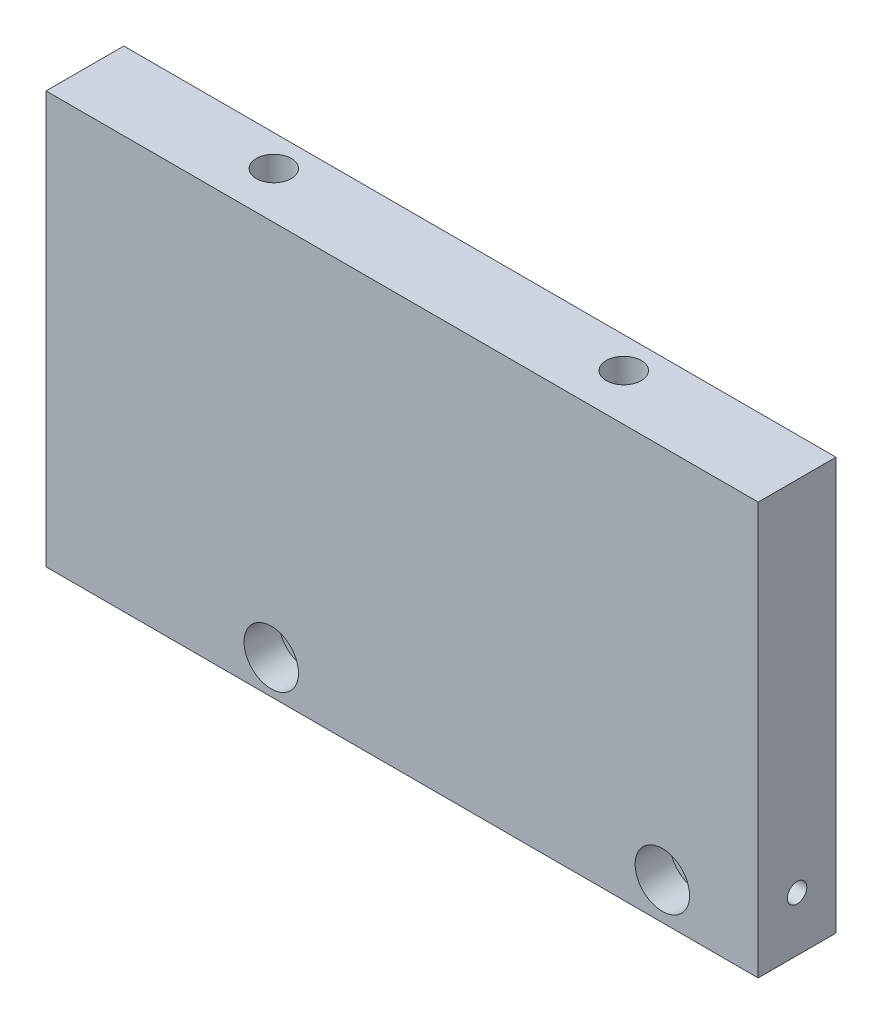
ISO-10303-21;
HEADER;
FILE_DESCRIPTION(('STEP AP214'),'2;1');
FILE_NAME('part.step','',(''),(''),'','','');
FILE_SCHEMA(('AUTOMOTIVE_DESIGN { 1 0 10303 214 1 1 1 1 }'));
ENDSEC;
DATA;
#1=APPLICATION_CONTEXT('core data for automotive mechanical design processes');
#2=APPLICATION_PROTOCOL_DEFINITION('international standard','automotive_design',2000,#1);
#3=PRODUCT_CONTEXT('',#1,'mechanical');
#4=PRODUCT('Part','Part','',(#3));
#5=PRODUCT_RELATED_PRODUCT_CATEGORY('part','',(#4));
#6=PRODUCT_DEFINITION_FORMATION('','',#4);
#7=PRODUCT_DEFINITION_CONTEXT('part definition',#1,'design');
#8=PRODUCT_DEFINITION('design','',#6,#7);
#9=PRODUCT_DEFINITION_SHAPE('','',#8);
#10=(LENGTH_UNIT() NAMED_UNIT(*) SI_UNIT(.MILLI.,.METRE.));
#11=(NAMED_UNIT(*) PLANE_ANGLE_UNIT() SI_UNIT($,.RADIAN.));
#12=(NAMED_UNIT(*) SI_UNIT($,.STERADIAN.) SOLID_ANGLE_UNIT());
#13=UNCERTAINTY_MEASURE_WITH_UNIT(LENGTH_MEASURE(1.E-05),#10,'distance_accuracy_value','');
#14=(GEOMETRIC_REPRESENTATION_CONTEXT(3) GLOBAL_UNCERTAINTY_ASSIGNED_CONTEXT((#13)) GLOBAL_UNIT_ASSIGNED_CONTEXT((#10,
#11,#12)) REPRESENTATION_CONTEXT('',''));
#15=CARTESIAN_POINT('',(0.,0.,0.));
#16=DIRECTION('',(0.,0.,1.));
#17=DIRECTION('',(1.,0.,0.));
#18=AXIS2_PLACEMENT_3D('',#15,#16,#17);
#19=CARTESIAN_POINT('',(-16.828,4.382,-5.));
#20=DIRECTION('',(0.,0.,1.));
#21=DIRECTION('',(1.,0.,0.));
#22=AXIS2_PLACEMENT_3D('',#19,#20,#21);
#23=CYLINDRICAL_SURFACE('',#22,1.75);
#24=CARTESIAN_POINT('',(-16.828,4.382,-5.));
#25=DIRECTION('',(0.,0.,1.));
#26=DIRECTION('',(1.,0.,0.));
#27=AXIS2_PLACEMENT_3D('',#24,#25,#26);
#28=CIRCLE('',#27,1.75);
#29=CARTESIAN_POINT('',(-15.078,4.382,-5.));
#30=VERTEX_POINT('',#29);
#31=EDGE_CURVE('E244',#30,#30,#28,.T.);
#32=ORIENTED_EDGE('',*,*,#31,.F.);
#33=EDGE_LOOP('',(#32));
#34=FACE_BOUND('',#33,.T.);
#35=CARTESIAN_POINT('',(-16.828,4.382,0.5));
#36=DIRECTION('',(0.,0.,1.));
#37=DIRECTION('',(1.,0.,0.));
#38=AXIS2_PLACEMENT_3D('',#35,#36,#37);
#39=CIRCLE('',#38,1.75);
#40=CARTESIAN_POINT('',(-15.078,4.382,0.5));
#41=VERTEX_POINT('',#40);
#42=EDGE_CURVE('E230',#41,#41,#39,.F.);
#43=ORIENTED_EDGE('',*,*,#42,.F.);
#44=EDGE_LOOP('',(#43));
#45=FACE_BOUND('',#44,.T.);
#46=ADVANCED_FACE('F49',(#34,#45),#23,.F.);
#47=CARTESIAN_POINT('',(33.464,4.763,-5.));
#48=DIRECTION('',(0.,0.,1.));
#49=DIRECTION('',(1.,0.,0.));
#50=AXIS2_PLACEMENT_3D('',#47,#48,#49);
#51=CYLINDRICAL_SURFACE('',#50,1.75);
#52=CARTESIAN_POINT('',(33.464,4.763,-5.));
#53=DIRECTION('',(0.,0.,1.));
#54=DIRECTION('',(1.,0.,0.));
#55=AXIS2_PLACEMENT_3D('',#52,#53,#54);
#56=CIRCLE('',#55,1.75);
#57=CARTESIAN_POINT('',(35.214,4.763,-5.));
#58=VERTEX_POINT('',#57);
#59=EDGE_CURVE('E280',#58,#58,#56,.T.);
#60=ORIENTED_EDGE('',*,*,#59,.F.);
#61=EDGE_LOOP('',(#60));
#62=FACE_BOUND('',#61,.T.);
#63=CARTESIAN_POINT('',(33.464,4.763,0.5));
#64=DIRECTION('',(0.,0.,1.));
#65=DIRECTION('',(1.,0.,0.));
#66=AXIS2_PLACEMENT_3D('',#63,#64,#65);
#67=CIRCLE('',#66,1.75);
#68=CARTESIAN_POINT('',(35.214,4.763,0.5));
#69=VERTEX_POINT('',#68);
#70=EDGE_CURVE('E214',#69,#69,#67,.F.);
#71=ORIENTED_EDGE('',*,*,#70,.F.);
#72=EDGE_LOOP('',(#71));
#73=FACE_BOUND('',#72,.T.);
#74=ADVANCED_FACE('F432',(#62,#73),#51,.F.);
#75=CARTESIAN_POINT('',(45.79,53.,-5.));
#76=DIRECTION('',(-1.,0.,0.));
#77=DIRECTION('',(0.,0.,1.));
#78=AXIS2_PLACEMENT_3D('',#75,#76,#77);
#79=PLANE('',#78);
#80=CARTESIAN_POINT('',(45.79,7.,0.));
#81=DIRECTION('',(1.,0.,0.));
#82=DIRECTION('',(0.,0.,-1.));
#83=AXIS2_PLACEMENT_3D('',#80,#81,#82);
#84=CIRCLE('',#83,1.24999999999999);
#85=CARTESIAN_POINT('',(45.79,7.,-1.24999999999999));
#86=VERTEX_POINT('',#85);
#87=EDGE_CURVE('E200',#86,#86,#84,.T.);
#88=ORIENTED_EDGE('',*,*,#87,.F.);
#89=EDGE_LOOP('',(#88));
#90=FACE_BOUND('',#89,.T.);
#91=DIRECTION('',(0.,0.,-1.));
#92=VECTOR('',#91,1.);
#93=CARTESIAN_POINT('',(45.79,0.,-5.));
#94=LINE('',#93,#92);
#95=CARTESIAN_POINT('',(45.79,0.,5.));
#96=VERTEX_POINT('',#95);
#97=CARTESIAN_POINT('',(45.79,0.,-5.));
#98=VERTEX_POINT('',#97);
#99=EDGE_CURVE('E283',#96,#98,#94,.T.);
#100=ORIENTED_EDGE('',*,*,#99,.T.);
#101=DIRECTION('',(0.,-1.,0.));
#102=VECTOR('',#101,1.);
#103=CARTESIAN_POINT('',(45.79,53.,-5.));
#104=LINE('',#103,#102);
#105=CARTESIAN_POINT('',(45.79,53.,-5.));
#106=VERTEX_POINT('',#105);
#107=EDGE_CURVE('E312',#106,#98,#104,.T.);
#108=ORIENTED_EDGE('',*,*,#107,.F.);
#109=DIRECTION('',(0.,0.,-1.));
#110=VECTOR('',#109,1.);
#111=CARTESIAN_POINT('',(45.79,53.,-5.));
#112=LINE('',#111,#110);
#113=CARTESIAN_POINT('',(45.79,53.,5.));
#114=VERTEX_POINT('',#113);
#115=EDGE_CURVE('E286',#114,#106,#112,.T.);
#116=ORIENTED_EDGE('',*,*,#115,.F.);
#117=DIRECTION('',(0.,-1.,0.));
#118=VECTOR('',#117,1.);
#119=CARTESIAN_POINT('',(45.79,53.,5.));
#120=LINE('',#119,#118);
#121=EDGE_CURVE('E296',#114,#96,#120,.T.);
#122=ORIENTED_EDGE('',*,*,#121,.T.);
#123=EDGE_LOOP('',(#100,#108,#116,#122));
#124=FACE_BOUND('',#123,.T.);
#125=ADVANCED_FACE('F439',(#90,#124),#79,.F.);
#126=CARTESIAN_POINT('',(-45.79,53.,-5.));
#127=DIRECTION('',(0.,0.,1.));
#128=DIRECTION('',(1.,0.,0.));
#129=AXIS2_PLACEMENT_3D('',#126,#127,#128);
#130=PLANE('',#129);
#131=DIRECTION('',(1.,0.,0.));
#132=VECTOR('',#131,1.);
#133=CARTESIAN_POINT('',(-30.,48.,-5.));
#134=LINE('',#133,#132);
#135=CARTESIAN_POINT('',(-27.5,48.,-5.));
#136=VERTEX_POINT('',#135);
#137=CARTESIAN_POINT('',(-17.5,48.,-5.));
#138=VERTEX_POINT('',#137);
#139=EDGE_CURVE('E248',#136,#138,#134,.T.);
#140=ORIENTED_EDGE('',*,*,#139,.F.);
#141=CARTESIAN_POINT('',(-27.5,45.5,-5.));
#142=DIRECTION('',(0.,0.,1.));
#143=DIRECTION('',(1.,0.,0.));
#144=AXIS2_PLACEMENT_3D('',#141,#142,#143);
#145=CIRCLE('',#144,2.5);
#146=CARTESIAN_POINT('',(-30.,45.5,-5.));
#147=VERTEX_POINT('',#146);
#148=EDGE_CURVE('E378',#136,#147,#145,.T.);
#149=ORIENTED_EDGE('',*,*,#148,.T.);
#150=DIRECTION('',(0.,1.,0.));
#151=VECTOR('',#150,1.);
#152=CARTESIAN_POINT('',(-30.,23.,-5.));
#153=LINE('',#152,#151);
#154=CARTESIAN_POINT('',(-30.,25.5,-5.));
#155=VERTEX_POINT('',#154);
#156=EDGE_CURVE('E245',#155,#147,#153,.T.);
#157=ORIENTED_EDGE('',*,*,#156,.F.);
#158=CARTESIAN_POINT('',(-27.5,25.5,-5.));
#159=DIRECTION('',(0.,0.,1.));
#160=DIRECTION('',(1.,0.,0.));
#161=AXIS2_PLACEMENT_3D('',#158,#159,#160);
#162=CIRCLE('',#161,2.5);
#163=CARTESIAN_POINT('',(-27.5,23.,-5.));
#164=VERTEX_POINT('',#163);
#165=EDGE_CURVE('E382',#155,#164,#162,.T.);
#166=ORIENTED_EDGE('',*,*,#165,.T.);
#167=DIRECTION('',(-1.,0.,0.));
#168=VECTOR('',#167,1.);
#169=CARTESIAN_POINT('',(-30.,23.,-5.));
#170=LINE('',#169,#168);
#171=CARTESIAN_POINT('',(-17.5,23.,-5.));
#172=VERTEX_POINT('',#171);
#173=EDGE_CURVE('E235',#172,#164,#170,.T.);
#174=ORIENTED_EDGE('',*,*,#173,.F.);
#175=CARTESIAN_POINT('',(-17.5,25.5,-5.));
#176=DIRECTION('',(0.,0.,1.));
#177=DIRECTION('',(1.,0.,0.));
#178=AXIS2_PLACEMENT_3D('',#175,#176,#177);
#179=CIRCLE('',#178,2.5);
#180=CARTESIAN_POINT('',(-15.,25.5,-5.));
#181=VERTEX_POINT('',#180);
#182=EDGE_CURVE('E380',#172,#181,#179,.T.);
#183=ORIENTED_EDGE('',*,*,#182,.T.);
#184=DIRECTION('',(0.,-1.,0.));
#185=VECTOR('',#184,1.);
#186=CARTESIAN_POINT('',(-15.,23.,-5.));
#187=LINE('',#186,#185);
#188=CARTESIAN_POINT('',(-15.,45.5,-5.));
#189=VERTEX_POINT('',#188);
#190=EDGE_CURVE('E252',#189,#181,#187,.T.);
#191=ORIENTED_EDGE('',*,*,#190,.F.);
#192=CARTESIAN_POINT('',(-17.5,45.5,-5.));
#193=DIRECTION('',(0.,0.,1.));
#194=DIRECTION('',(1.,0.,0.));
#195=AXIS2_PLACEMENT_3D('',#192,#193,#194);
#196=CIRCLE('',#195,2.5);
#197=EDGE_CURVE('E384',#189,#138,#196,.T.);
#198=ORIENTED_EDGE('',*,*,#197,.T.);
#199=EDGE_LOOP('',(#140,#149,#157,#166,#174,#183,#191,#198));
#200=FACE_BOUND('',#199,.T.);
#201=DIRECTION('',(1.,0.,0.));
#202=VECTOR('',#201,1.);
#203=CARTESIAN_POINT('',(15.,48.,-5.));
#204=LINE('',#203,#202);
#205=CARTESIAN_POINT('',(17.5,48.,-5.));
#206=VERTEX_POINT('',#205);
#207=CARTESIAN_POINT('',(27.5,48.,-5.));
#208=VERTEX_POINT('',#207);
#209=EDGE_CURVE('E264',#206,#208,#204,.T.);
#210=ORIENTED_EDGE('',*,*,#209,.F.);
#211=CARTESIAN_POINT('',(17.5,45.5,-5.));
#212=DIRECTION('',(0.,0.,1.));
#213=DIRECTION('',(1.,0.,0.));
#214=AXIS2_PLACEMENT_3D('',#211,#212,#213);
#215=CIRCLE('',#214,2.5);
#216=CARTESIAN_POINT('',(15.,45.5,-5.));
#217=VERTEX_POINT('',#216);
#218=EDGE_CURVE('E11',#206,#217,#215,.T.);
#219=ORIENTED_EDGE('',*,*,#218,.T.);
#220=DIRECTION('',(0.,1.,0.));
#221=VECTOR('',#220,1.);
#222=CARTESIAN_POINT('',(15.,48.,-5.));
#223=LINE('',#222,#221);
#224=CARTESIAN_POINT('',(15.,25.5,-5.));
#225=VERTEX_POINT('',#224);
#226=EDGE_CURVE('E249',#225,#217,#223,.T.);
#227=ORIENTED_EDGE('',*,*,#226,.F.);
#228=CARTESIAN_POINT('',(17.5,25.5,-5.));
#229=DIRECTION('',(0.,0.,1.));
#230=DIRECTION('',(1.,0.,0.));
#231=AXIS2_PLACEMENT_3D('',#228,#229,#230);
#232=CIRCLE('',#231,2.5);
#233=CARTESIAN_POINT('',(17.5,23.,-5.));
#234=VERTEX_POINT('',#233);
#235=EDGE_CURVE('E57',#225,#234,#232,.T.);
#236=ORIENTED_EDGE('',*,*,#235,.T.);
#237=DIRECTION('',(-1.,0.,0.));
#238=VECTOR('',#237,1.);
#239=CARTESIAN_POINT('',(15.,23.,-5.));
#240=LINE('',#239,#238);
#241=CARTESIAN_POINT('',(27.5,23.,-5.));
#242=VERTEX_POINT('',#241);
#243=EDGE_CURVE('E257',#242,#234,#240,.T.);
#244=ORIENTED_EDGE('',*,*,#243,.F.);
#245=CARTESIAN_POINT('',(27.5,25.5,-5.));
#246=DIRECTION('',(0.,0.,1.));
#247=DIRECTION('',(1.,0.,0.));
#248=AXIS2_PLACEMENT_3D('',#245,#246,#247);
#249=CIRCLE('',#248,2.5);
#250=CARTESIAN_POINT('',(30.,25.5,-5.));
#251=VERTEX_POINT('',#250);
#252=EDGE_CURVE('E388',#242,#251,#249,.T.);
#253=ORIENTED_EDGE('',*,*,#252,.T.);
#254=DIRECTION('',(0.,-1.,0.));
#255=VECTOR('',#254,1.);
#256=CARTESIAN_POINT('',(30.,48.,-5.));
#257=LINE('',#256,#255);
#258=CARTESIAN_POINT('',(30.,45.5,-5.));
#259=VERTEX_POINT('',#258);
#260=EDGE_CURVE('E260',#259,#251,#257,.T.);
#261=ORIENTED_EDGE('',*,*,#260,.F.);
#262=CARTESIAN_POINT('',(27.5,45.5,-5.));
#263=DIRECTION('',(0.,0.,1.));
#264=DIRECTION('',(1.,0.,0.));
#265=AXIS2_PLACEMENT_3D('',#262,#263,#264);
#266=CIRCLE('',#265,2.5);
#267=EDGE_CURVE('E386',#259,#208,#266,.T.);
#268=ORIENTED_EDGE('',*,*,#267,.T.);
#269=EDGE_LOOP('',(#210,#219,#227,#236,#244,#253,#261,#268));
#270=FACE_BOUND('',#269,.T.);
#271=ORIENTED_EDGE('',*,*,#59,.T.);
#272=EDGE_LOOP('',(#271));
#273=FACE_BOUND('',#272,.T.);
#274=ORIENTED_EDGE('',*,*,#31,.T.);
#275=EDGE_LOOP('',(#274));
#276=FACE_BOUND('',#275,.T.);
#277=DIRECTION('',(-1.,0.,0.));
#278=VECTOR('',#277,1.);
#279=CARTESIAN_POINT('',(-45.79,0.,-5.));
#280=LINE('',#279,#278);
#281=CARTESIAN_POINT('',(-45.79,0.,-5.));
#282=VERTEX_POINT('',#281);
#283=EDGE_CURVE('E299',#98,#282,#280,.T.);
#284=ORIENTED_EDGE('',*,*,#283,.T.);
#285=DIRECTION('',(0.,-1.,0.));
#286=VECTOR('',#285,1.);
#287=CARTESIAN_POINT('',(-45.79,53.,-5.));
#288=LINE('',#287,#286);
#289=CARTESIAN_POINT('',(-45.79,53.,-5.));
#290=VERTEX_POINT('',#289);
#291=EDGE_CURVE('E309',#290,#282,#288,.T.);
#292=ORIENTED_EDGE('',*,*,#291,.F.);
#293=DIRECTION('',(-1.,0.,0.));
#294=VECTOR('',#293,1.);
#295=CARTESIAN_POINT('',(-45.79,53.,-5.));
#296=LINE('',#295,#294);
#297=EDGE_CURVE('E289',#106,#290,#296,.T.);
#298=ORIENTED_EDGE('',*,*,#297,.F.);
#299=ORIENTED_EDGE('',*,*,#107,.T.);
#300=EDGE_LOOP('',(#284,#292,#298,#299));
#301=FACE_BOUND('',#300,.T.);
#302=ADVANCED_FACE('F390',(#200,#270,#273,#276,#301),#130,.F.);
#303=CARTESIAN_POINT('',(-45.79,53.,-5.));
#304=DIRECTION('',(1.,0.,0.));
#305=DIRECTION('',(0.,0.,-1.));
#306=AXIS2_PLACEMENT_3D('',#303,#304,#305);
#307=PLANE('',#306);
#308=CARTESIAN_POINT('',(-45.79,7.,0.));
#309=DIRECTION('',(-1.,0.,0.));
#310=DIRECTION('',(0.,0.,1.));
#311=AXIS2_PLACEMENT_3D('',#308,#309,#310);
#312=CIRCLE('',#311,1.24999999999999);
#313=CARTESIAN_POINT('',(-45.79,7.,1.24999999999999));
#314=VERTEX_POINT('',#313);
#315=EDGE_CURVE('E199',#314,#314,#312,.T.);
#316=ORIENTED_EDGE('',*,*,#315,.F.);
#317=EDGE_LOOP('',(#316));
#318=FACE_BOUND('',#317,.T.);
#319=DIRECTION('',(0.,0.,1.));
#320=VECTOR('',#319,1.);
#321=CARTESIAN_POINT('',(-45.79,0.,-5.));
#322=LINE('',#321,#320);
#323=CARTESIAN_POINT('',(-45.79,0.,5.));
#324=VERTEX_POINT('',#323);
#325=EDGE_CURVE('E301',#282,#324,#322,.T.);
#326=ORIENTED_EDGE('',*,*,#325,.T.);
#327=DIRECTION('',(0.,-1.,0.));
#328=VECTOR('',#327,1.);
#329=CARTESIAN_POINT('',(-45.79,53.,5.));
#330=LINE('',#329,#328);
#331=CARTESIAN_POINT('',(-45.79,53.,5.));
#332=VERTEX_POINT('',#331);
#333=EDGE_CURVE('E306',#332,#324,#330,.T.);
#334=ORIENTED_EDGE('',*,*,#333,.F.);
#335=DIRECTION('',(0.,0.,1.));
#336=VECTOR('',#335,1.);
#337=CARTESIAN_POINT('',(-45.79,53.,-5.));
#338=LINE('',#337,#336);
#339=EDGE_CURVE('E292',#290,#332,#338,.T.);
#340=ORIENTED_EDGE('',*,*,#339,.F.);
#341=ORIENTED_EDGE('',*,*,#291,.T.);
#342=EDGE_LOOP('',(#326,#334,#340,#341));
#343=FACE_BOUND('',#342,.T.);
#344=ADVANCED_FACE('F457',(#318,#343),#307,.F.);
#345=CARTESIAN_POINT('',(-45.79,53.,5.));
#346=DIRECTION('',(0.,0.,-1.));
#347=DIRECTION('',(-1.,0.,0.));
#348=AXIS2_PLACEMENT_3D('',#345,#346,#347);
#349=PLANE('',#348);
#350=CARTESIAN_POINT('',(33.464,4.763,5.));
#351=DIRECTION('',(0.,0.,1.));
#352=DIRECTION('',(1.,0.,0.));
#353=AXIS2_PLACEMENT_3D('',#350,#351,#352);
#354=CIRCLE('',#353,3.5);
#355=CARTESIAN_POINT('',(36.964,4.763,5.));
#356=VERTEX_POINT('',#355);
#357=EDGE_CURVE('E215',#356,#356,#354,.T.);
#358=ORIENTED_EDGE('',*,*,#357,.F.);
#359=EDGE_LOOP('',(#358));
#360=FACE_BOUND('',#359,.T.);
#361=CARTESIAN_POINT('',(-16.828,4.382,5.));
#362=DIRECTION('',(0.,0.,1.));
#363=DIRECTION('',(1.,0.,0.));
#364=AXIS2_PLACEMENT_3D('',#361,#362,#363);
#365=CIRCLE('',#364,3.5);
#366=CARTESIAN_POINT('',(-13.328,4.382,5.));
#367=VERTEX_POINT('',#366);
#368=EDGE_CURVE('E218',#367,#367,#365,.T.);
#369=ORIENTED_EDGE('',*,*,#368,.F.);
#370=EDGE_LOOP('',(#369));
#371=FACE_BOUND('',#370,.T.);
#372=DIRECTION('',(1.,0.,0.));
#373=VECTOR('',#372,1.);
#374=CARTESIAN_POINT('',(-45.79,0.,5.));
#375=LINE('',#374,#373);
#376=EDGE_CURVE('E290',#324,#96,#375,.T.);
#377=ORIENTED_EDGE('',*,*,#376,.T.);
#378=ORIENTED_EDGE('',*,*,#121,.F.);
#379=DIRECTION('',(1.,0.,0.));
#380=VECTOR('',#379,1.);
#381=CARTESIAN_POINT('',(-45.79,53.,5.));
#382=LINE('',#381,#380);
#383=EDGE_CURVE('E294',#332,#114,#382,.T.);
#384=ORIENTED_EDGE('',*,*,#383,.F.);
#385=ORIENTED_EDGE('',*,*,#333,.T.);
#386=EDGE_LOOP('',(#377,#378,#384,#385));
#387=FACE_BOUND('',#386,.T.);
#388=ADVANCED_FACE('F450',(#360,#371,#387),#349,.F.);
#389=CARTESIAN_POINT('',(0.,53.,0.));
#390=DIRECTION('',(0.,1.,0.));
#391=DIRECTION('',(0.,0.,1.));
#392=AXIS2_PLACEMENT_3D('',#389,#390,#391);
#393=PLANE('',#392);
#394=CARTESIAN_POINT('',(22.5,53.,-1.));
#395=DIRECTION('',(0.,1.,0.));
#396=DIRECTION('',(0.,0.,1.));
#397=AXIS2_PLACEMENT_3D('',#394,#395,#396);
#398=CIRCLE('',#397,2.25);
#399=CARTESIAN_POINT('',(22.5,53.,1.25));
#400=VERTEX_POINT('',#399);
#401=EDGE_CURVE('E223',#400,#400,#398,.T.);
#402=ORIENTED_EDGE('',*,*,#401,.F.);
#403=EDGE_LOOP('',(#402));
#404=FACE_BOUND('',#403,.T.);
#405=CARTESIAN_POINT('',(-22.5,53.,-1.));
#406=DIRECTION('',(0.,1.,0.));
#407=DIRECTION('',(0.,0.,1.));
#408=AXIS2_PLACEMENT_3D('',#405,#406,#407);
#409=CIRCLE('',#408,2.25);
#410=CARTESIAN_POINT('',(-22.5,53.,1.25));
#411=VERTEX_POINT('',#410);
#412=EDGE_CURVE('E227',#411,#411,#409,.T.);
#413=ORIENTED_EDGE('',*,*,#412,.F.);
#414=EDGE_LOOP('',(#413));
#415=FACE_BOUND('',#414,.T.);
#416=ORIENTED_EDGE('',*,*,#115,.T.);
#417=ORIENTED_EDGE('',*,*,#297,.T.);
#418=ORIENTED_EDGE('',*,*,#339,.T.);
#419=ORIENTED_EDGE('',*,*,#383,.T.);
#420=EDGE_LOOP('',(#416,#417,#418,#419));
#421=FACE_BOUND('',#420,.T.);
#422=ADVANCED_FACE('F446',(#404,#415,#421),#393,.T.);
#423=CARTESIAN_POINT('',(0.,0.,0.));
#424=DIRECTION('',(0.,1.,0.));
#425=DIRECTION('',(0.,0.,1.));
#426=AXIS2_PLACEMENT_3D('',#423,#424,#425);
#427=PLANE('',#426);
#428=ORIENTED_EDGE('',*,*,#99,.F.);
#429=ORIENTED_EDGE('',*,*,#376,.F.);
#430=ORIENTED_EDGE('',*,*,#325,.F.);
#431=ORIENTED_EDGE('',*,*,#283,.F.);
#432=EDGE_LOOP('',(#428,#429,#430,#431));
#433=FACE_BOUND('',#432,.T.);
#434=ADVANCED_FACE('F449',(#433),#427,.F.);
#435=CARTESIAN_POINT('',(15.,48.,3.));
#436=DIRECTION('',(-1.,0.,0.));
#437=DIRECTION('',(0.,-1.,0.));
#438=AXIS2_PLACEMENT_3D('',#435,#436,#437);
#439=PLANE('',#438);
#440=DIRECTION('',(0.,1.,0.));
#441=VECTOR('',#440,1.);
#442=CARTESIAN_POINT('',(15.,48.,3.));
#443=LINE('',#442,#441);
#444=CARTESIAN_POINT('',(15.,25.5,3.));
#445=VERTEX_POINT('',#444);
#446=CARTESIAN_POINT('',(15.,45.5,3.));
#447=VERTEX_POINT('',#446);
#448=EDGE_CURVE('E261',#445,#447,#443,.T.);
#449=ORIENTED_EDGE('',*,*,#448,.F.);
#450=DIRECTION('',(0.,0.,-1.));
#451=VECTOR('',#450,1.);
#452=CARTESIAN_POINT('',(15.,25.5,-5.));
#453=LINE('',#452,#451);
#454=EDGE_CURVE('E376',#445,#225,#453,.T.);
#455=ORIENTED_EDGE('',*,*,#454,.T.);
#456=ORIENTED_EDGE('',*,*,#226,.T.);
#457=DIRECTION('',(0.,0.,-1.));
#458=VECTOR('',#457,1.);
#459=CARTESIAN_POINT('',(15.,45.5,3.));
#460=LINE('',#459,#458);
#461=EDGE_CURVE('E374',#217,#447,#460,.F.);
#462=ORIENTED_EDGE('',*,*,#461,.T.);
#463=EDGE_LOOP('',(#449,#455,#456,#462));
#464=FACE_BOUND('',#463,.T.);
#465=ADVANCED_FACE('F403',(#464),#439,.F.);
#466=CARTESIAN_POINT('',(15.,23.,3.));
#467=DIRECTION('',(0.,-1.,0.));
#468=DIRECTION('',(0.,0.,-1.));
#469=AXIS2_PLACEMENT_3D('',#466,#467,#468);
#470=PLANE('',#469);
#471=DIRECTION('',(-1.,0.,0.));
#472=VECTOR('',#471,1.);
#473=CARTESIAN_POINT('',(15.,23.,3.));
#474=LINE('',#473,#472);
#475=CARTESIAN_POINT('',(27.5,23.,3.));
#476=VERTEX_POINT('',#475);
#477=CARTESIAN_POINT('',(17.5,23.,3.));
#478=VERTEX_POINT('',#477);
#479=EDGE_CURVE('E268',#476,#478,#474,.T.);
#480=ORIENTED_EDGE('',*,*,#479,.F.);
#481=DIRECTION('',(0.,0.,-1.));
#482=VECTOR('',#481,1.);
#483=CARTESIAN_POINT('',(27.5,23.,-5.));
#484=LINE('',#483,#482);
#485=EDGE_CURVE('E371',#476,#242,#484,.T.);
#486=ORIENTED_EDGE('',*,*,#485,.T.);
#487=ORIENTED_EDGE('',*,*,#243,.T.);
#488=DIRECTION('',(0.,0.,-1.));
#489=VECTOR('',#488,1.);
#490=CARTESIAN_POINT('',(17.5,23.,3.));
#491=LINE('',#490,#489);
#492=EDGE_CURVE('E369',#234,#478,#491,.F.);
#493=ORIENTED_EDGE('',*,*,#492,.T.);
#494=EDGE_LOOP('',(#480,#486,#487,#493));
#495=FACE_BOUND('',#494,.T.);
#496=ADVANCED_FACE('F394',(#495),#470,.F.);
#497=CARTESIAN_POINT('',(30.,48.,3.));
#498=DIRECTION('',(1.,0.,0.));
#499=DIRECTION('',(0.,1.,0.));
#500=AXIS2_PLACEMENT_3D('',#497,#498,#499);
#501=PLANE('',#500);
#502=DIRECTION('',(0.,-1.,0.));
#503=VECTOR('',#502,1.);
#504=CARTESIAN_POINT('',(30.,48.,3.));
#505=LINE('',#504,#503);
#506=CARTESIAN_POINT('',(30.,45.5,3.));
#507=VERTEX_POINT('',#506);
#508=CARTESIAN_POINT('',(30.,25.5,3.));
#509=VERTEX_POINT('',#508);
#510=EDGE_CURVE('E271',#507,#509,#505,.T.);
#511=ORIENTED_EDGE('',*,*,#510,.F.);
#512=DIRECTION('',(0.,0.,-1.));
#513=VECTOR('',#512,1.);
#514=CARTESIAN_POINT('',(30.,45.5,-5.));
#515=LINE('',#514,#513);
#516=EDGE_CURVE('E353',#507,#259,#515,.T.);
#517=ORIENTED_EDGE('',*,*,#516,.T.);
#518=ORIENTED_EDGE('',*,*,#260,.T.);
#519=DIRECTION('',(0.,0.,-1.));
#520=VECTOR('',#519,1.);
#521=CARTESIAN_POINT('',(30.,25.5,3.));
#522=LINE('',#521,#520);
#523=EDGE_CURVE('E351',#251,#509,#522,.F.);
#524=ORIENTED_EDGE('',*,*,#523,.T.);
#525=EDGE_LOOP('',(#511,#517,#518,#524));
#526=FACE_BOUND('',#525,.T.);
#527=ADVANCED_FACE('F418',(#526),#501,.F.);
#528=CARTESIAN_POINT('',(15.,48.,3.));
#529=DIRECTION('',(0.,1.,0.));
#530=DIRECTION('',(0.,0.,1.));
#531=AXIS2_PLACEMENT_3D('',#528,#529,#530);
#532=PLANE('',#531);
#533=CARTESIAN_POINT('',(22.5,48.,-1.));
#534=DIRECTION('',(0.,1.,0.));
#535=DIRECTION('',(0.,0.,1.));
#536=AXIS2_PLACEMENT_3D('',#533,#534,#535);
#537=CIRCLE('',#536,2.25);
#538=CARTESIAN_POINT('',(22.5,48.,1.25));
#539=VERTEX_POINT('',#538);
#540=EDGE_CURVE('E272',#539,#539,#537,.T.);
#541=ORIENTED_EDGE('',*,*,#540,.T.);
#542=EDGE_LOOP('',(#541));
#543=FACE_BOUND('',#542,.T.);
#544=ORIENTED_EDGE('',*,*,#209,.T.);
#545=DIRECTION('',(0.,0.,-1.));
#546=VECTOR('',#545,1.);
#547=CARTESIAN_POINT('',(27.5,48.,3.));
#548=LINE('',#547,#546);
#549=CARTESIAN_POINT('',(27.5,48.,3.));
#550=VERTEX_POINT('',#549);
#551=EDGE_CURVE('E359',#208,#550,#548,.F.);
#552=ORIENTED_EDGE('',*,*,#551,.T.);
#553=DIRECTION('',(1.,0.,0.));
#554=VECTOR('',#553,1.);
#555=CARTESIAN_POINT('',(15.,48.,3.));
#556=LINE('',#555,#554);
#557=CARTESIAN_POINT('',(17.5,48.,3.));
#558=VERTEX_POINT('',#557);
#559=EDGE_CURVE('E275',#558,#550,#556,.T.);
#560=ORIENTED_EDGE('',*,*,#559,.F.);
#561=DIRECTION('',(0.,0.,-1.));
#562=VECTOR('',#561,1.);
#563=CARTESIAN_POINT('',(17.5,48.,-5.));
#564=LINE('',#563,#562);
#565=EDGE_CURVE('E356',#558,#206,#564,.T.);
#566=ORIENTED_EDGE('',*,*,#565,.T.);
#567=EDGE_LOOP('',(#544,#552,#560,#566));
#568=FACE_BOUND('',#567,.T.);
#569=ADVANCED_FACE('F410',(#543,#568),#532,.F.);
#570=CARTESIAN_POINT('',(0.,0.,3.));
#571=DIRECTION('',(0.,0.,1.));
#572=DIRECTION('',(1.,0.,0.));
#573=AXIS2_PLACEMENT_3D('',#570,#571,#572);
#574=PLANE('',#573);
#575=ORIENTED_EDGE('',*,*,#559,.T.);
#576=CARTESIAN_POINT('',(27.5,45.5,3.));
#577=DIRECTION('',(0.,0.,1.));
#578=DIRECTION('',(1.,0.,0.));
#579=AXIS2_PLACEMENT_3D('',#576,#577,#578);
#580=CIRCLE('',#579,2.5);
#581=EDGE_CURVE('E367',#550,#507,#580,.F.);
#582=ORIENTED_EDGE('',*,*,#581,.T.);
#583=ORIENTED_EDGE('',*,*,#510,.T.);
#584=CARTESIAN_POINT('',(27.5,25.5,3.));
#585=DIRECTION('',(0.,0.,1.));
#586=DIRECTION('',(1.,0.,0.));
#587=AXIS2_PLACEMENT_3D('',#584,#585,#586);
#588=CIRCLE('',#587,2.5);
#589=EDGE_CURVE('E365',#509,#476,#588,.F.);
#590=ORIENTED_EDGE('',*,*,#589,.T.);
#591=ORIENTED_EDGE('',*,*,#479,.T.);
#592=CARTESIAN_POINT('',(17.5,25.5,3.));
#593=DIRECTION('',(0.,0.,1.));
#594=DIRECTION('',(1.,0.,0.));
#595=AXIS2_PLACEMENT_3D('',#592,#593,#594);
#596=CIRCLE('',#595,2.5);
#597=EDGE_CURVE('E363',#478,#445,#596,.F.);
#598=ORIENTED_EDGE('',*,*,#597,.T.);
#599=ORIENTED_EDGE('',*,*,#448,.T.);
#600=CARTESIAN_POINT('',(17.5,45.5,3.));
#601=DIRECTION('',(0.,0.,1.));
#602=DIRECTION('',(1.,0.,0.));
#603=AXIS2_PLACEMENT_3D('',#600,#601,#602);
#604=CIRCLE('',#603,2.5);
#605=EDGE_CURVE('E361',#447,#558,#604,.F.);
#606=ORIENTED_EDGE('',*,*,#605,.T.);
#607=EDGE_LOOP('',(#575,#582,#583,#590,#591,#598,#599,#606));
#608=FACE_BOUND('',#607,.T.);
#609=ADVANCED_FACE('F400',(#608),#574,.F.);
#610=CARTESIAN_POINT('',(-30.,23.,3.));
#611=DIRECTION('',(-1.,0.,0.));
#612=DIRECTION('',(0.,-1.,0.));
#613=AXIS2_PLACEMENT_3D('',#610,#611,#612);
#614=PLANE('',#613);
#615=ORIENTED_EDGE('',*,*,#156,.T.);
#616=DIRECTION('',(0.,0.,-1.));
#617=VECTOR('',#616,1.);
#618=CARTESIAN_POINT('',(-30.,45.5,3.));
#619=LINE('',#618,#617);
#620=CARTESIAN_POINT('',(-30.,45.5,3.));
#621=VERTEX_POINT('',#620);
#622=EDGE_CURVE('E331',#147,#621,#619,.F.);
#623=ORIENTED_EDGE('',*,*,#622,.T.);
#624=DIRECTION('',(0.,1.,0.));
#625=VECTOR('',#624,1.);
#626=CARTESIAN_POINT('',(-30.,23.,3.));
#627=LINE('',#626,#625);
#628=CARTESIAN_POINT('',(-30.,25.5,3.));
#629=VERTEX_POINT('',#628);
#630=EDGE_CURVE('E231',#629,#621,#627,.T.);
#631=ORIENTED_EDGE('',*,*,#630,.F.);
#632=DIRECTION('',(0.,0.,-1.));
#633=VECTOR('',#632,1.);
#634=CARTESIAN_POINT('',(-30.,25.5,-5.));
#635=LINE('',#634,#633);
#636=EDGE_CURVE('E328',#629,#155,#635,.T.);
#637=ORIENTED_EDGE('',*,*,#636,.T.);
#638=EDGE_LOOP('',(#615,#623,#631,#637));
#639=FACE_BOUND('',#638,.T.);
#640=ADVANCED_FACE('F507',(#639),#614,.F.);
#641=CARTESIAN_POINT('',(-30.,23.,3.));
#642=DIRECTION('',(0.,-1.,0.));
#643=DIRECTION('',(1.,0.,0.));
#644=AXIS2_PLACEMENT_3D('',#641,#642,#643);
#645=PLANE('',#644);
#646=DIRECTION('',(-1.,0.,0.));
#647=VECTOR('',#646,1.);
#648=CARTESIAN_POINT('',(-30.,23.,3.));
#649=LINE('',#648,#647);
#650=CARTESIAN_POINT('',(-17.5,23.,3.));
#651=VERTEX_POINT('',#650);
#652=CARTESIAN_POINT('',(-27.5,23.,3.));
#653=VERTEX_POINT('',#652);
#654=EDGE_CURVE('E241',#651,#653,#649,.T.);
#655=ORIENTED_EDGE('',*,*,#654,.F.);
#656=DIRECTION('',(0.,0.,-1.));
#657=VECTOR('',#656,1.);
#658=CARTESIAN_POINT('',(-17.5,23.,-5.));
#659=LINE('',#658,#657);
#660=EDGE_CURVE('E343',#651,#172,#659,.T.);
#661=ORIENTED_EDGE('',*,*,#660,.T.);
#662=ORIENTED_EDGE('',*,*,#173,.T.);
#663=DIRECTION('',(0.,0.,-1.));
#664=VECTOR('',#663,1.);
#665=CARTESIAN_POINT('',(-27.5,23.,3.));
#666=LINE('',#665,#664);
#667=EDGE_CURVE('E341',#164,#653,#666,.F.);
#668=ORIENTED_EDGE('',*,*,#667,.T.);
#669=EDGE_LOOP('',(#655,#661,#662,#668));
#670=FACE_BOUND('',#669,.T.);
#671=ADVANCED_FACE('F500',(#670),#645,.F.);
#672=CARTESIAN_POINT('',(-15.,23.,3.));
#673=DIRECTION('',(1.,0.,0.));
#674=DIRECTION('',(0.,0.,-1.));
#675=AXIS2_PLACEMENT_3D('',#672,#673,#674);
#676=PLANE('',#675);
#677=ORIENTED_EDGE('',*,*,#190,.T.);
#678=DIRECTION('',(0.,0.,-1.));
#679=VECTOR('',#678,1.);
#680=CARTESIAN_POINT('',(-15.,25.5,3.));
#681=LINE('',#680,#679);
#682=CARTESIAN_POINT('',(-15.,25.5,3.));
#683=VERTEX_POINT('',#682);
#684=EDGE_CURVE('E349',#181,#683,#681,.F.);
#685=ORIENTED_EDGE('',*,*,#684,.T.);
#686=DIRECTION('',(0.,-1.,0.));
#687=VECTOR('',#686,1.);
#688=CARTESIAN_POINT('',(-15.,23.,3.));
#689=LINE('',#688,#687);
#690=CARTESIAN_POINT('',(-15.,45.5,3.));
#691=VERTEX_POINT('',#690);
#692=EDGE_CURVE('E238',#691,#683,#689,.T.);
#693=ORIENTED_EDGE('',*,*,#692,.F.);
#694=DIRECTION('',(0.,0.,-1.));
#695=VECTOR('',#694,1.);
#696=CARTESIAN_POINT('',(-15.,45.5,-5.));
#697=LINE('',#696,#695);
#698=EDGE_CURVE('E346',#691,#189,#697,.T.);
#699=ORIENTED_EDGE('',*,*,#698,.T.);
#700=EDGE_LOOP('',(#677,#685,#693,#699));
#701=FACE_BOUND('',#700,.T.);
#702=ADVANCED_FACE('F493',(#701),#676,.F.);
#703=CARTESIAN_POINT('',(-30.,48.,3.));
#704=DIRECTION('',(0.,1.,0.));
#705=DIRECTION('',(-1.,0.,0.));
#706=AXIS2_PLACEMENT_3D('',#703,#704,#705);
#707=PLANE('',#706);
#708=CARTESIAN_POINT('',(-22.5,48.,-1.));
#709=DIRECTION('',(0.,1.,0.));
#710=DIRECTION('',(-1.,0.,0.));
#711=AXIS2_PLACEMENT_3D('',#708,#709,#710);
#712=CIRCLE('',#711,2.25);
#713=CARTESIAN_POINT('',(-24.75,48.,-1.));
#714=VERTEX_POINT('',#713);
#715=EDGE_CURVE('E226',#714,#714,#712,.T.);
#716=ORIENTED_EDGE('',*,*,#715,.T.);
#717=EDGE_LOOP('',(#716));
#718=FACE_BOUND('',#717,.T.);
#719=DIRECTION('',(1.,0.,0.));
#720=VECTOR('',#719,1.);
#721=CARTESIAN_POINT('',(-30.,48.,3.));
#722=LINE('',#721,#720);
#723=CARTESIAN_POINT('',(-27.5,48.,3.));
#724=VERTEX_POINT('',#723);
#725=CARTESIAN_POINT('',(-17.5,48.,3.));
#726=VERTEX_POINT('',#725);
#727=EDGE_CURVE('E234',#724,#726,#722,.T.);
#728=ORIENTED_EDGE('',*,*,#727,.F.);
#729=DIRECTION('',(0.,0.,-1.));
#730=VECTOR('',#729,1.);
#731=CARTESIAN_POINT('',(-27.5,48.,-5.));
#732=LINE('',#731,#730);
#733=EDGE_CURVE('E325',#724,#136,#732,.T.);
#734=ORIENTED_EDGE('',*,*,#733,.T.);
#735=ORIENTED_EDGE('',*,*,#139,.T.);
#736=DIRECTION('',(0.,0.,-1.));
#737=VECTOR('',#736,1.);
#738=CARTESIAN_POINT('',(-17.5,48.,3.));
#739=LINE('',#738,#737);
#740=EDGE_CURVE('E315',#138,#726,#739,.F.);
#741=ORIENTED_EDGE('',*,*,#740,.T.);
#742=EDGE_LOOP('',(#728,#734,#735,#741));
#743=FACE_BOUND('',#742,.T.);
#744=ADVANCED_FACE('F512',(#718,#743),#707,.F.);
#745=CARTESIAN_POINT('',(0.,0.,3.));
#746=DIRECTION('',(0.,0.,-1.));
#747=DIRECTION('',(-1.,0.,0.));
#748=AXIS2_PLACEMENT_3D('',#745,#746,#747);
#749=PLANE('',#748);
#750=ORIENTED_EDGE('',*,*,#630,.T.);
#751=CARTESIAN_POINT('',(-27.5,45.5,3.));
#752=DIRECTION('',(0.,0.,-1.));
#753=DIRECTION('',(-1.,0.,0.));
#754=AXIS2_PLACEMENT_3D('',#751,#752,#753);
#755=CIRCLE('',#754,2.5);
#756=EDGE_CURVE('E339',#621,#724,#755,.T.);
#757=ORIENTED_EDGE('',*,*,#756,.T.);
#758=ORIENTED_EDGE('',*,*,#727,.T.);
#759=CARTESIAN_POINT('',(-17.5,45.5,3.));
#760=DIRECTION('',(0.,0.,-1.));
#761=DIRECTION('',(-1.,0.,0.));
#762=AXIS2_PLACEMENT_3D('',#759,#760,#761);
#763=CIRCLE('',#762,2.5);
#764=EDGE_CURVE('E333',#726,#691,#763,.T.);
#765=ORIENTED_EDGE('',*,*,#764,.T.);
#766=ORIENTED_EDGE('',*,*,#692,.T.);
#767=CARTESIAN_POINT('',(-17.5,25.5,3.));
#768=DIRECTION('',(0.,0.,-1.));
#769=DIRECTION('',(-1.,0.,0.));
#770=AXIS2_PLACEMENT_3D('',#767,#768,#769);
#771=CIRCLE('',#770,2.5);
#772=EDGE_CURVE('E337',#683,#651,#771,.T.);
#773=ORIENTED_EDGE('',*,*,#772,.T.);
#774=ORIENTED_EDGE('',*,*,#654,.T.);
#775=CARTESIAN_POINT('',(-27.5,25.5,3.));
#776=DIRECTION('',(0.,0.,-1.));
#777=DIRECTION('',(-1.,0.,0.));
#778=AXIS2_PLACEMENT_3D('',#775,#776,#777);
#779=CIRCLE('',#778,2.5);
#780=EDGE_CURVE('E335',#653,#629,#779,.T.);
#781=ORIENTED_EDGE('',*,*,#780,.T.);
#782=EDGE_LOOP('',(#750,#757,#758,#765,#766,#773,#774,#781));
#783=FACE_BOUND('',#782,.T.);
#784=ADVANCED_FACE('F489',(#783),#749,.T.);
#785=CARTESIAN_POINT('',(-22.5,36.,-1.));
#786=DIRECTION('',(0.,1.,0.));
#787=DIRECTION('',(0.,0.,1.));
#788=AXIS2_PLACEMENT_3D('',#785,#786,#787);
#789=CYLINDRICAL_SURFACE('',#788,2.25);
#790=ORIENTED_EDGE('',*,*,#412,.T.);
#791=EDGE_LOOP('',(#790));
#792=FACE_BOUND('',#791,.T.);
#793=ORIENTED_EDGE('',*,*,#715,.F.);
#794=EDGE_LOOP('',(#793));
#795=FACE_BOUND('',#794,.T.);
#796=ADVANCED_FACE('F521',(#792,#795),#789,.F.);
#797=CARTESIAN_POINT('',(22.5,36.,-1.));
#798=DIRECTION('',(0.,1.,0.));
#799=DIRECTION('',(0.,0.,1.));
#800=AXIS2_PLACEMENT_3D('',#797,#798,#799);
#801=CYLINDRICAL_SURFACE('',#800,2.25);
#802=ORIENTED_EDGE('',*,*,#401,.T.);
#803=EDGE_LOOP('',(#802));
#804=FACE_BOUND('',#803,.T.);
#805=ORIENTED_EDGE('',*,*,#540,.F.);
#806=EDGE_LOOP('',(#805));
#807=FACE_BOUND('',#806,.T.);
#808=ADVANCED_FACE('F577',(#804,#807),#801,.F.);
#809=CARTESIAN_POINT('',(33.464,4.763,0.5));
#810=DIRECTION('',(0.,0.,1.));
#811=DIRECTION('',(1.,0.,0.));
#812=AXIS2_PLACEMENT_3D('',#809,#810,#811);
#813=PLANE('',#812);
#814=CARTESIAN_POINT('',(33.464,4.763,0.5));
#815=DIRECTION('',(0.,0.,1.));
#816=DIRECTION('',(1.,0.,0.));
#817=AXIS2_PLACEMENT_3D('',#814,#815,#816);
#818=CIRCLE('',#817,3.5);
#819=CARTESIAN_POINT('',(36.964,4.763,0.5));
#820=VERTEX_POINT('',#819);
#821=EDGE_CURVE('E211',#820,#820,#818,.T.);
#822=ORIENTED_EDGE('',*,*,#821,.T.);
#823=EDGE_LOOP('',(#822));
#824=FACE_BOUND('',#823,.T.);
#825=ORIENTED_EDGE('',*,*,#70,.T.);
#826=EDGE_LOOP('',(#825));
#827=FACE_BOUND('',#826,.T.);
#828=ADVANCED_FACE('F586',(#824,#827),#813,.T.);
#829=CARTESIAN_POINT('',(33.464,4.763,0.5));
#830=DIRECTION('',(0.,0.,1.));
#831=DIRECTION('',(1.,0.,0.));
#832=AXIS2_PLACEMENT_3D('',#829,#830,#831);
#833=CYLINDRICAL_SURFACE('',#832,3.5);
#834=ORIENTED_EDGE('',*,*,#821,.F.);
#835=EDGE_LOOP('',(#834));
#836=FACE_BOUND('',#835,.T.);
#837=ORIENTED_EDGE('',*,*,#357,.T.);
#838=EDGE_LOOP('',(#837));
#839=FACE_BOUND('',#838,.T.);
#840=ADVANCED_FACE('F605',(#836,#839),#833,.F.);
#841=CARTESIAN_POINT('',(-16.828,4.382,0.5));
#842=DIRECTION('',(0.,0.,1.));
#843=DIRECTION('',(1.,0.,0.));
#844=AXIS2_PLACEMENT_3D('',#841,#842,#843);
#845=PLANE('',#844);
#846=CARTESIAN_POINT('',(-16.828,4.382,0.5));
#847=DIRECTION('',(0.,0.,1.));
#848=DIRECTION('',(1.,0.,0.));
#849=AXIS2_PLACEMENT_3D('',#846,#847,#848);
#850=CIRCLE('',#849,3.5);
#851=CARTESIAN_POINT('',(-13.328,4.382,0.5));
#852=VERTEX_POINT('',#851);
#853=EDGE_CURVE('E210',#852,#852,#850,.T.);
#854=ORIENTED_EDGE('',*,*,#853,.T.);
#855=EDGE_LOOP('',(#854));
#856=FACE_BOUND('',#855,.T.);
#857=ORIENTED_EDGE('',*,*,#42,.T.);
#858=EDGE_LOOP('',(#857));
#859=FACE_BOUND('',#858,.T.);
#860=ADVANCED_FACE('F615',(#856,#859),#845,.T.);
#861=CARTESIAN_POINT('',(-16.828,4.382,0.5));
#862=DIRECTION('',(0.,0.,1.));
#863=DIRECTION('',(1.,0.,0.));
#864=AXIS2_PLACEMENT_3D('',#861,#862,#863);
#865=CYLINDRICAL_SURFACE('',#864,3.5);
#866=ORIENTED_EDGE('',*,*,#853,.F.);
#867=EDGE_LOOP('',(#866));
#868=FACE_BOUND('',#867,.T.);
#869=ORIENTED_EDGE('',*,*,#368,.T.);
#870=EDGE_LOOP('',(#869));
#871=FACE_BOUND('',#870,.T.);
#872=ADVANCED_FACE('F625',(#868,#871),#865,.F.);
#873=CARTESIAN_POINT('',(-38.29,7.,0.));
#874=DIRECTION('',(-1.,0.,0.));
#875=DIRECTION('',(0.,0.,1.));
#876=AXIS2_PLACEMENT_3D('',#873,#874,#875);
#877=CONICAL_SURFACE('',#876,1.24999999999999,1.02974425867665);
#878=CARTESIAN_POINT('',(-37.5389242262155,7.,0.));
#879=VERTEX_POINT('',#878);
#880=VERTEX_LOOP('',#879);
#881=FACE_BOUND('',#880,.T.);
#882=CARTESIAN_POINT('',(-38.29,7.,0.));
#883=DIRECTION('',(-1.,0.,0.));
#884=DIRECTION('',(0.,0.,1.));
#885=AXIS2_PLACEMENT_3D('',#882,#883,#884);
#886=CIRCLE('',#885,1.24999999999999);
#887=CARTESIAN_POINT('',(-38.29,7.,1.24999999999999));
#888=VERTEX_POINT('',#887);
#889=EDGE_CURVE('E203',#888,#888,#886,.T.);
#890=ORIENTED_EDGE('',*,*,#889,.T.);
#891=EDGE_LOOP('',(#890));
#892=FACE_BOUND('',#891,.T.);
#893=ADVANCED_FACE('F635',(#881,#892),#877,.F.);
#894=CARTESIAN_POINT('',(-45.79,7.,0.));
#895=DIRECTION('',(-1.,0.,0.));
#896=DIRECTION('',(0.,0.,1.));
#897=AXIS2_PLACEMENT_3D('',#894,#895,#896);
#898=CYLINDRICAL_SURFACE('',#897,1.24999999999999);
#899=ORIENTED_EDGE('',*,*,#889,.F.);
#900=EDGE_LOOP('',(#899));
#901=FACE_BOUND('',#900,.T.);
#902=ORIENTED_EDGE('',*,*,#315,.T.);
#903=EDGE_LOOP('',(#902));
#904=FACE_BOUND('',#903,.T.);
#905=ADVANCED_FACE('F193',(#901,#904),#898,.F.);
#906=CARTESIAN_POINT('',(38.29,7.,0.));
#907=DIRECTION('',(1.,0.,0.));
#908=DIRECTION('',(0.,0.,-1.));
#909=AXIS2_PLACEMENT_3D('',#906,#907,#908);
#910=CONICAL_SURFACE('',#909,1.24999999999999,1.02974425867665);
#911=CARTESIAN_POINT('',(37.5389242262155,7.,0.));
#912=VERTEX_POINT('',#911);
#913=VERTEX_LOOP('',#912);
#914=FACE_BOUND('',#913,.T.);
#915=CARTESIAN_POINT('',(38.29,7.,0.));
#916=DIRECTION('',(1.,0.,0.));
#917=DIRECTION('',(0.,0.,-1.));
#918=AXIS2_PLACEMENT_3D('',#915,#916,#917);
#919=CIRCLE('',#918,1.24999999999999);
#920=CARTESIAN_POINT('',(38.29,7.,-1.24999999999999));
#921=VERTEX_POINT('',#920);
#922=EDGE_CURVE('E197',#921,#921,#919,.T.);
#923=ORIENTED_EDGE('',*,*,#922,.T.);
#924=EDGE_LOOP('',(#923));
#925=FACE_BOUND('',#924,.T.);
#926=ADVANCED_FACE('F189',(#914,#925),#910,.F.);
#927=CARTESIAN_POINT('',(45.79,7.,0.));
#928=DIRECTION('',(1.,0.,0.));
#929=DIRECTION('',(0.,0.,-1.));
#930=AXIS2_PLACEMENT_3D('',#927,#928,#929);
#931=CYLINDRICAL_SURFACE('',#930,1.24999999999999);
#932=ORIENTED_EDGE('',*,*,#922,.F.);
#933=EDGE_LOOP('',(#932));
#934=FACE_BOUND('',#933,.T.);
#935=ORIENTED_EDGE('',*,*,#87,.T.);
#936=EDGE_LOOP('',(#935));
#937=FACE_BOUND('',#936,.T.);
#938=ADVANCED_FACE('F192',(#934,#937),#931,.F.);
#939=CARTESIAN_POINT('',(-27.5,45.5,3.));
#940=DIRECTION('',(0.,0.,1.));
#941=DIRECTION('',(1.,0.,0.));
#942=AXIS2_PLACEMENT_3D('',#939,#940,#941);
#943=CYLINDRICAL_SURFACE('',#942,2.5);
#944=ORIENTED_EDGE('',*,*,#756,.F.);
#945=ORIENTED_EDGE('',*,*,#622,.F.);
#946=ORIENTED_EDGE('',*,*,#148,.F.);
#947=ORIENTED_EDGE('',*,*,#733,.F.);
#948=EDGE_LOOP('',(#944,#945,#946,#947));
#949=FACE_BOUND('',#948,.T.);
#950=ADVANCED_FACE('F468',(#949),#943,.F.);
#951=CARTESIAN_POINT('',(-17.5,25.5,3.));
#952=DIRECTION('',(0.,0.,1.));
#953=DIRECTION('',(1.,0.,0.));
#954=AXIS2_PLACEMENT_3D('',#951,#952,#953);
#955=CYLINDRICAL_SURFACE('',#954,2.5);
#956=ORIENTED_EDGE('',*,*,#772,.F.);
#957=ORIENTED_EDGE('',*,*,#684,.F.);
#958=ORIENTED_EDGE('',*,*,#182,.F.);
#959=ORIENTED_EDGE('',*,*,#660,.F.);
#960=EDGE_LOOP('',(#956,#957,#958,#959));
#961=FACE_BOUND('',#960,.T.);
#962=ADVANCED_FACE('F471',(#961),#955,.F.);
#963=CARTESIAN_POINT('',(-27.5,25.5,3.));
#964=DIRECTION('',(0.,0.,1.));
#965=DIRECTION('',(1.,0.,0.));
#966=AXIS2_PLACEMENT_3D('',#963,#964,#965);
#967=CYLINDRICAL_SURFACE('',#966,2.5);
#968=ORIENTED_EDGE('',*,*,#780,.F.);
#969=ORIENTED_EDGE('',*,*,#667,.F.);
#970=ORIENTED_EDGE('',*,*,#165,.F.);
#971=ORIENTED_EDGE('',*,*,#636,.F.);
#972=EDGE_LOOP('',(#968,#969,#970,#971));
#973=FACE_BOUND('',#972,.T.);
#974=ADVANCED_FACE('F475',(#973),#967,.F.);
#975=CARTESIAN_POINT('',(-17.5,45.5,3.));
#976=DIRECTION('',(0.,0.,1.));
#977=DIRECTION('',(1.,0.,0.));
#978=AXIS2_PLACEMENT_3D('',#975,#976,#977);
#979=CYLINDRICAL_SURFACE('',#978,2.5);
#980=ORIENTED_EDGE('',*,*,#764,.F.);
#981=ORIENTED_EDGE('',*,*,#740,.F.);
#982=ORIENTED_EDGE('',*,*,#197,.F.);
#983=ORIENTED_EDGE('',*,*,#698,.F.);
#984=EDGE_LOOP('',(#980,#981,#982,#983));
#985=FACE_BOUND('',#984,.T.);
#986=ADVANCED_FACE('F429',(#985),#979,.F.);
#987=CARTESIAN_POINT('',(27.5,45.5,3.));
#988=DIRECTION('',(0.,0.,1.));
#989=DIRECTION('',(1.,0.,0.));
#990=AXIS2_PLACEMENT_3D('',#987,#988,#989);
#991=CYLINDRICAL_SURFACE('',#990,2.5);
#992=ORIENTED_EDGE('',*,*,#581,.F.);
#993=ORIENTED_EDGE('',*,*,#551,.F.);
#994=ORIENTED_EDGE('',*,*,#267,.F.);
#995=ORIENTED_EDGE('',*,*,#516,.F.);
#996=EDGE_LOOP('',(#992,#993,#994,#995));
#997=FACE_BOUND('',#996,.T.);
#998=ADVANCED_FACE('F413',(#997),#991,.F.);
#999=CARTESIAN_POINT('',(27.5,25.5,3.));
#1000=DIRECTION('',(0.,0.,1.));
#1001=DIRECTION('',(1.,0.,0.));
#1002=AXIS2_PLACEMENT_3D('',#999,#1000,#1001);
#1003=CYLINDRICAL_SURFACE('',#1002,2.5);
#1004=ORIENTED_EDGE('',*,*,#589,.F.);
#1005=ORIENTED_EDGE('',*,*,#523,.F.);
#1006=ORIENTED_EDGE('',*,*,#252,.F.);
#1007=ORIENTED_EDGE('',*,*,#485,.F.);
#1008=EDGE_LOOP('',(#1004,#1005,#1006,#1007));
#1009=FACE_BOUND('',#1008,.T.);
#1010=ADVANCED_FACE('F422',(#1009),#1003,.F.);
#1011=CARTESIAN_POINT('',(17.5,25.5,3.));
#1012=DIRECTION('',(0.,0.,1.));
#1013=DIRECTION('',(1.,0.,0.));
#1014=AXIS2_PLACEMENT_3D('',#1011,#1012,#1013);
#1015=CYLINDRICAL_SURFACE('',#1014,2.5);
#1016=ORIENTED_EDGE('',*,*,#597,.F.);
#1017=ORIENTED_EDGE('',*,*,#492,.F.);
#1018=ORIENTED_EDGE('',*,*,#235,.F.);
#1019=ORIENTED_EDGE('',*,*,#454,.F.);
#1020=EDGE_LOOP('',(#1016,#1017,#1018,#1019));
#1021=FACE_BOUND('',#1020,.T.);
#1022=ADVANCED_FACE('F397',(#1021),#1015,.F.);
#1023=CARTESIAN_POINT('',(17.5,45.5,3.));
#1024=DIRECTION('',(0.,0.,1.));
#1025=DIRECTION('',(1.,0.,0.));
#1026=AXIS2_PLACEMENT_3D('',#1023,#1024,#1025);
#1027=CYLINDRICAL_SURFACE('',#1026,2.5);
#1028=ORIENTED_EDGE('',*,*,#605,.F.);
#1029=ORIENTED_EDGE('',*,*,#461,.F.);
#1030=ORIENTED_EDGE('',*,*,#218,.F.);
#1031=ORIENTED_EDGE('',*,*,#565,.F.);
#1032=EDGE_LOOP('',(#1028,#1029,#1030,#1031));
#1033=FACE_BOUND('',#1032,.T.);
#1034=ADVANCED_FACE('F51',(#1033),#1027,.F.);
#1035=CLOSED_SHELL('',(#46,#74,#125,#302,#344,#388,#422,#434,#465,#496,#527,#569,#609,#640,#671,
#702,#744,#784,#796,#808,#828,#840,#860,#872,#893,#905,#926,#938,#950,#962,#974,#986,#998,#1010,
#1022,#1034));
#1036=MANIFOLD_SOLID_BREP('B2',#1035);
#1037=ADVANCED_BREP_SHAPE_REPRESENTATION('',(#18,#1036),#14);
#1038=SHAPE_DEFINITION_REPRESENTATION(#9,#1037);
ENDSEC;
END-ISO-10303-21;
